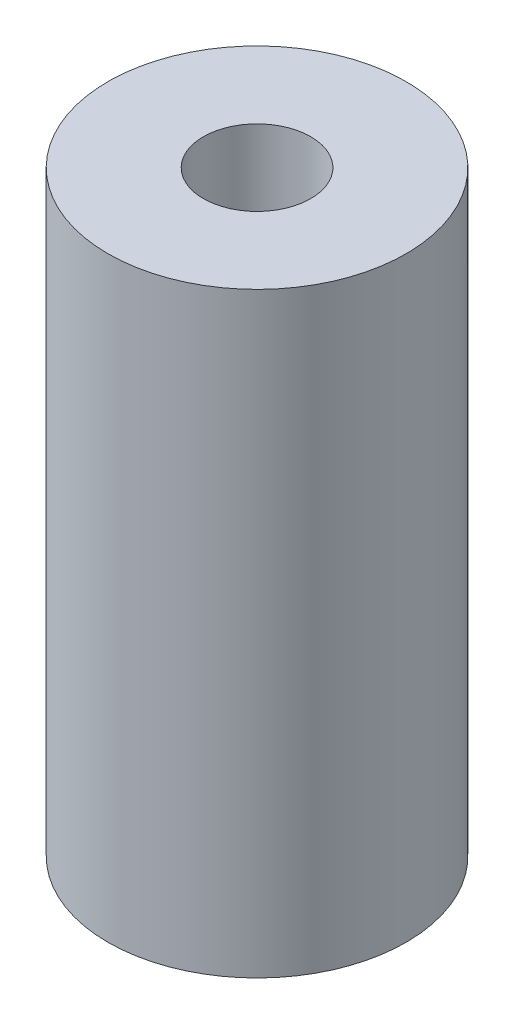
ISO-10303-21;
HEADER;
FILE_DESCRIPTION(('STEP AP214'),'2;1');
FILE_NAME('part.step','',(''),(''),'','','');
FILE_SCHEMA(('AUTOMOTIVE_DESIGN { 1 0 10303 214 1 1 1 1 }'));
ENDSEC;
DATA;
#1=APPLICATION_CONTEXT('core data for automotive mechanical design processes');
#2=APPLICATION_PROTOCOL_DEFINITION('international standard','automotive_design',2000,#1);
#3=PRODUCT_CONTEXT('',#1,'mechanical');
#4=PRODUCT('Part','Part','',(#3));
#5=PRODUCT_RELATED_PRODUCT_CATEGORY('part','',(#4));
#6=PRODUCT_DEFINITION_FORMATION('','',#4);
#7=PRODUCT_DEFINITION_CONTEXT('part definition',#1,'design');
#8=PRODUCT_DEFINITION('design','',#6,#7);
#9=PRODUCT_DEFINITION_SHAPE('','',#8);
#10=(LENGTH_UNIT() NAMED_UNIT(*) SI_UNIT(.MILLI.,.METRE.));
#11=(NAMED_UNIT(*) PLANE_ANGLE_UNIT() SI_UNIT($,.RADIAN.));
#12=(NAMED_UNIT(*) SI_UNIT($,.STERADIAN.) SOLID_ANGLE_UNIT());
#13=UNCERTAINTY_MEASURE_WITH_UNIT(LENGTH_MEASURE(1.E-05),#10,'distance_accuracy_value','');
#14=(GEOMETRIC_REPRESENTATION_CONTEXT(3) GLOBAL_UNCERTAINTY_ASSIGNED_CONTEXT((#13)) GLOBAL_UNIT_ASSIGNED_CONTEXT((#10,
#11,#12)) REPRESENTATION_CONTEXT('',''));
#15=CARTESIAN_POINT('',(0.,0.,0.));
#16=DIRECTION('',(0.,0.,1.));
#17=DIRECTION('',(1.,0.,0.));
#18=AXIS2_PLACEMENT_3D('',#15,#16,#17);
#19=CARTESIAN_POINT('',(0.,12.7,0.));
#20=DIRECTION('',(0.,-1.,0.));
#21=DIRECTION('',(0.,0.,-1.));
#22=AXIS2_PLACEMENT_3D('',#19,#20,#21);
#23=CYLINDRICAL_SURFACE('',#22,3.175);
#24=CARTESIAN_POINT('',(0.,12.7,0.));
#25=DIRECTION('',(0.,1.,0.));
#26=DIRECTION('',(0.,0.,1.));
#27=AXIS2_PLACEMENT_3D('',#24,#25,#26);
#28=CIRCLE('',#27,3.175);
#29=CARTESIAN_POINT('',(0.,12.7,3.175));
#30=VERTEX_POINT('',#29);
#31=EDGE_CURVE('E10',#30,#30,#28,.T.);
#32=ORIENTED_EDGE('',*,*,#31,.F.);
#33=EDGE_LOOP('',(#32));
#34=FACE_BOUND('',#33,.T.);
#35=CARTESIAN_POINT('',(0.,0.,0.));
#36=DIRECTION('',(0.,1.,0.));
#37=DIRECTION('',(0.,0.,1.));
#38=AXIS2_PLACEMENT_3D('',#35,#36,#37);
#39=CIRCLE('',#38,3.175);
#40=CARTESIAN_POINT('',(0.,0.,3.175));
#41=VERTEX_POINT('',#40);
#42=EDGE_CURVE('E34',#41,#41,#39,.T.);
#43=ORIENTED_EDGE('',*,*,#42,.T.);
#44=EDGE_LOOP('',(#43));
#45=FACE_BOUND('',#44,.T.);
#46=ADVANCED_FACE('F31',(#34,#45),#23,.T.);
#47=CARTESIAN_POINT('',(0.,12.7,0.));
#48=DIRECTION('',(0.,1.,0.));
#49=DIRECTION('',(0.,0.,1.));
#50=AXIS2_PLACEMENT_3D('',#47,#48,#49);
#51=PLANE('',#50);
#52=CARTESIAN_POINT('',(0.,12.7,0.));
#53=DIRECTION('',(0.,-1.,0.));
#54=DIRECTION('',(0.,0.,-1.));
#55=AXIS2_PLACEMENT_3D('',#52,#53,#54);
#56=CIRCLE('',#55,1.143);
#57=CARTESIAN_POINT('',(0.,12.7,-1.143));
#58=VERTEX_POINT('',#57);
#59=EDGE_CURVE('E41',#58,#58,#56,.T.);
#60=ORIENTED_EDGE('',*,*,#59,.T.);
#61=EDGE_LOOP('',(#60));
#62=FACE_BOUND('',#61,.T.);
#63=ORIENTED_EDGE('',*,*,#31,.T.);
#64=EDGE_LOOP('',(#63));
#65=FACE_BOUND('',#64,.T.);
#66=ADVANCED_FACE('F49',(#62,#65),#51,.T.);
#67=CARTESIAN_POINT('',(0.,0.,0.));
#68=DIRECTION('',(0.,1.,0.));
#69=DIRECTION('',(0.,0.,1.));
#70=AXIS2_PLACEMENT_3D('',#67,#68,#69);
#71=PLANE('',#70);
#72=CARTESIAN_POINT('',(0.,0.,0.));
#73=DIRECTION('',(0.,-1.,0.));
#74=DIRECTION('',(0.,0.,-1.));
#75=AXIS2_PLACEMENT_3D('',#72,#73,#74);
#76=CIRCLE('',#75,1.143);
#77=CARTESIAN_POINT('',(0.,0.,-1.143));
#78=VERTEX_POINT('',#77);
#79=EDGE_CURVE('E43',#78,#78,#76,.T.);
#80=ORIENTED_EDGE('',*,*,#79,.F.);
#81=EDGE_LOOP('',(#80));
#82=FACE_BOUND('',#81,.T.);
#83=ORIENTED_EDGE('',*,*,#42,.F.);
#84=EDGE_LOOP('',(#83));
#85=FACE_BOUND('',#84,.T.);
#86=ADVANCED_FACE('F54',(#82,#85),#71,.F.);
#87=CARTESIAN_POINT('',(0.,12.7,0.));
#88=DIRECTION('',(0.,-1.,0.));
#89=DIRECTION('',(0.,0.,-1.));
#90=AXIS2_PLACEMENT_3D('',#87,#88,#89);
#91=CYLINDRICAL_SURFACE('',#90,1.143);
#92=ORIENTED_EDGE('',*,*,#59,.F.);
#93=EDGE_LOOP('',(#92));
#94=FACE_BOUND('',#93,.T.);
#95=ORIENTED_EDGE('',*,*,#79,.T.);
#96=EDGE_LOOP('',(#95));
#97=FACE_BOUND('',#96,.T.);
#98=ADVANCED_FACE('F51',(#94,#97),#91,.F.);
#99=CLOSED_SHELL('',(#46,#66,#86,#98));
#100=MANIFOLD_SOLID_BREP('B2',#99);
#101=ADVANCED_BREP_SHAPE_REPRESENTATION('',(#18,#100),#14);
#102=SHAPE_DEFINITION_REPRESENTATION(#9,#101);
ENDSEC;
END-ISO-10303-21;
